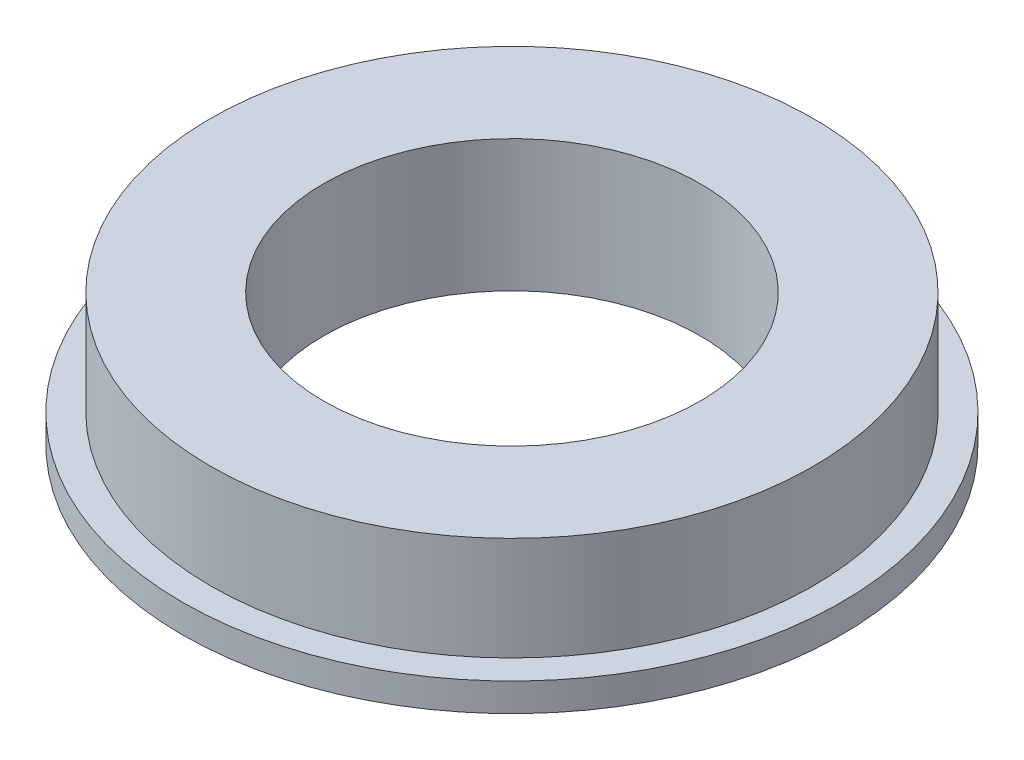
ISO-10303-21;
HEADER;
FILE_DESCRIPTION(('STEP AP214'),'2;1');
FILE_NAME('part.step','',(''),(''),'','','');
FILE_SCHEMA(('AUTOMOTIVE_DESIGN { 1 0 10303 214 1 1 1 1 }'));
ENDSEC;
DATA;
#1=APPLICATION_CONTEXT('core data for automotive mechanical design processes');
#2=APPLICATION_PROTOCOL_DEFINITION('international standard','automotive_design',2000,#1);
#3=PRODUCT_CONTEXT('',#1,'mechanical');
#4=PRODUCT('Part','Part','',(#3));
#5=PRODUCT_RELATED_PRODUCT_CATEGORY('part','',(#4));
#6=PRODUCT_DEFINITION_FORMATION('','',#4);
#7=PRODUCT_DEFINITION_CONTEXT('part definition',#1,'design');
#8=PRODUCT_DEFINITION('design','',#6,#7);
#9=PRODUCT_DEFINITION_SHAPE('','',#8);
#10=(LENGTH_UNIT() NAMED_UNIT(*) SI_UNIT(.MILLI.,.METRE.));
#11=(NAMED_UNIT(*) PLANE_ANGLE_UNIT() SI_UNIT($,.RADIAN.));
#12=(NAMED_UNIT(*) SI_UNIT($,.STERADIAN.) SOLID_ANGLE_UNIT());
#13=UNCERTAINTY_MEASURE_WITH_UNIT(LENGTH_MEASURE(1.E-05),#10,'distance_accuracy_value','');
#14=(GEOMETRIC_REPRESENTATION_CONTEXT(3) GLOBAL_UNCERTAINTY_ASSIGNED_CONTEXT((#13)) GLOBAL_UNIT_ASSIGNED_CONTEXT((#10,
#11,#12)) REPRESENTATION_CONTEXT('',''));
#15=CARTESIAN_POINT('',(0.,0.,0.));
#16=DIRECTION('',(0.,0.,1.));
#17=DIRECTION('',(1.,0.,0.));
#18=AXIS2_PLACEMENT_3D('',#15,#16,#17);
#19=CARTESIAN_POINT('',(0.,1.5,0.));
#20=DIRECTION('',(0.,1.,0.));
#21=DIRECTION('',(0.,0.,1.));
#22=AXIS2_PLACEMENT_3D('',#19,#20,#21);
#23=PLANE('',#22);
#24=CARTESIAN_POINT('',(0.,1.5,0.));
#25=DIRECTION('',(0.,1.,0.));
#26=DIRECTION('',(0.,0.,1.));
#27=AXIS2_PLACEMENT_3D('',#24,#25,#26);
#28=CIRCLE('',#27,16.);
#29=CARTESIAN_POINT('',(0.,1.5,16.));
#30=VERTEX_POINT('',#29);
#31=EDGE_CURVE('E10',#30,#30,#28,.T.);
#32=ORIENTED_EDGE('',*,*,#31,.F.);
#33=EDGE_LOOP('',(#32));
#34=FACE_BOUND('',#33,.T.);
#35=CARTESIAN_POINT('',(0.,1.5,0.));
#36=DIRECTION('',(0.,1.,0.));
#37=DIRECTION('',(0.,0.,1.));
#38=AXIS2_PLACEMENT_3D('',#35,#36,#37);
#39=CIRCLE('',#38,17.5);
#40=CARTESIAN_POINT('',(0.,1.5,17.5));
#41=VERTEX_POINT('',#40);
#42=EDGE_CURVE('E41',#41,#41,#39,.T.);
#43=ORIENTED_EDGE('',*,*,#42,.T.);
#44=EDGE_LOOP('',(#43));
#45=FACE_BOUND('',#44,.T.);
#46=ADVANCED_FACE('F33',(#34,#45),#23,.T.);
#47=CARTESIAN_POINT('',(0.,0.,0.));
#48=DIRECTION('',(0.,1.,0.));
#49=DIRECTION('',(0.,0.,1.));
#50=AXIS2_PLACEMENT_3D('',#47,#48,#49);
#51=PLANE('',#50);
#52=CARTESIAN_POINT('',(0.,0.,0.));
#53=DIRECTION('',(0.,1.,0.));
#54=DIRECTION('',(0.,0.,1.));
#55=AXIS2_PLACEMENT_3D('',#52,#53,#54);
#56=CIRCLE('',#55,17.5);
#57=CARTESIAN_POINT('',(0.,0.,17.5));
#58=VERTEX_POINT('',#57);
#59=EDGE_CURVE('E37',#58,#58,#56,.T.);
#60=ORIENTED_EDGE('',*,*,#59,.F.);
#61=EDGE_LOOP('',(#60));
#62=FACE_BOUND('',#61,.T.);
#63=CARTESIAN_POINT('',(0.,0.,0.));
#64=DIRECTION('',(0.,1.,0.));
#65=DIRECTION('',(0.,0.,1.));
#66=AXIS2_PLACEMENT_3D('',#63,#64,#65);
#67=CIRCLE('',#66,10.);
#68=CARTESIAN_POINT('',(0.,0.,10.));
#69=VERTEX_POINT('',#68);
#70=EDGE_CURVE('E50',#69,#69,#67,.T.);
#71=ORIENTED_EDGE('',*,*,#70,.T.);
#72=EDGE_LOOP('',(#71));
#73=FACE_BOUND('',#72,.T.);
#74=ADVANCED_FACE('F77',(#62,#73),#51,.F.);
#75=CARTESIAN_POINT('',(0.,1.5,0.));
#76=DIRECTION('',(0.,-1.,0.));
#77=DIRECTION('',(0.,0.,-1.));
#78=AXIS2_PLACEMENT_3D('',#75,#76,#77);
#79=CYLINDRICAL_SURFACE('',#78,17.5);
#80=ORIENTED_EDGE('',*,*,#42,.F.);
#81=EDGE_LOOP('',(#80));
#82=FACE_BOUND('',#81,.T.);
#83=ORIENTED_EDGE('',*,*,#59,.T.);
#84=EDGE_LOOP('',(#83));
#85=FACE_BOUND('',#84,.T.);
#86=ADVANCED_FACE('F35',(#82,#85),#79,.T.);
#87=CARTESIAN_POINT('',(0.,1.5,0.));
#88=DIRECTION('',(0.,-1.,0.));
#89=DIRECTION('',(0.,0.,-1.));
#90=AXIS2_PLACEMENT_3D('',#87,#88,#89);
#91=CYLINDRICAL_SURFACE('',#90,10.);
#92=ORIENTED_EDGE('',*,*,#70,.F.);
#93=EDGE_LOOP('',(#92));
#94=FACE_BOUND('',#93,.T.);
#95=CARTESIAN_POINT('',(0.,7.,0.));
#96=DIRECTION('',(0.,1.,0.));
#97=DIRECTION('',(0.,0.,1.));
#98=AXIS2_PLACEMENT_3D('',#95,#96,#97);
#99=CIRCLE('',#98,10.);
#100=CARTESIAN_POINT('',(0.,7.,10.));
#101=VERTEX_POINT('',#100);
#102=EDGE_CURVE('E56',#101,#101,#99,.T.);
#103=ORIENTED_EDGE('',*,*,#102,.T.);
#104=EDGE_LOOP('',(#103));
#105=FACE_BOUND('',#104,.T.);
#106=ADVANCED_FACE('F62',(#94,#105),#91,.F.);
#107=CARTESIAN_POINT('',(0.,7.,0.));
#108=DIRECTION('',(0.,1.,0.));
#109=DIRECTION('',(0.,0.,1.));
#110=AXIS2_PLACEMENT_3D('',#107,#108,#109);
#111=PLANE('',#110);
#112=CARTESIAN_POINT('',(0.,7.,0.));
#113=DIRECTION('',(0.,1.,0.));
#114=DIRECTION('',(0.,0.,1.));
#115=AXIS2_PLACEMENT_3D('',#112,#113,#114);
#116=CIRCLE('',#115,16.);
#117=CARTESIAN_POINT('',(0.,7.,16.));
#118=VERTEX_POINT('',#117);
#119=EDGE_CURVE('E48',#118,#118,#116,.T.);
#120=ORIENTED_EDGE('',*,*,#119,.T.);
#121=EDGE_LOOP('',(#120));
#122=FACE_BOUND('',#121,.T.);
#123=ORIENTED_EDGE('',*,*,#102,.F.);
#124=EDGE_LOOP('',(#123));
#125=FACE_BOUND('',#124,.T.);
#126=ADVANCED_FACE('F64',(#122,#125),#111,.T.);
#127=CARTESIAN_POINT('',(0.,7.,0.));
#128=DIRECTION('',(0.,-1.,0.));
#129=DIRECTION('',(0.,0.,-1.));
#130=AXIS2_PLACEMENT_3D('',#127,#128,#129);
#131=CYLINDRICAL_SURFACE('',#130,16.);
#132=ORIENTED_EDGE('',*,*,#119,.F.);
#133=EDGE_LOOP('',(#132));
#134=FACE_BOUND('',#133,.T.);
#135=ORIENTED_EDGE('',*,*,#31,.T.);
#136=EDGE_LOOP('',(#135));
#137=FACE_BOUND('',#136,.T.);
#138=ADVANCED_FACE('F66',(#134,#137),#131,.T.);
#139=CLOSED_SHELL('',(#46,#74,#86,#106,#126,#138));
#140=MANIFOLD_SOLID_BREP('B2',#139);
#141=ADVANCED_BREP_SHAPE_REPRESENTATION('',(#18,#140),#14);
#142=SHAPE_DEFINITION_REPRESENTATION(#9,#141);
ENDSEC;
END-ISO-10303-21;
